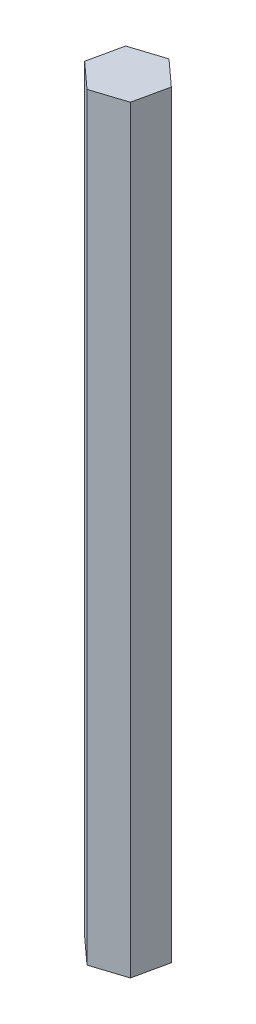
ISO-10303-21;
HEADER;
FILE_DESCRIPTION(('STEP AP214'),'2;1');
FILE_NAME('part.step','',(''),(''),'','','');
FILE_SCHEMA(('AUTOMOTIVE_DESIGN { 1 0 10303 214 1 1 1 1 }'));
ENDSEC;
DATA;
#1=APPLICATION_CONTEXT('core data for automotive mechanical design processes');
#2=APPLICATION_PROTOCOL_DEFINITION('international standard','automotive_design',2000,#1);
#3=PRODUCT_CONTEXT('',#1,'mechanical');
#4=PRODUCT('Part','Part','',(#3));
#5=PRODUCT_RELATED_PRODUCT_CATEGORY('part','',(#4));
#6=PRODUCT_DEFINITION_FORMATION('','',#4);
#7=PRODUCT_DEFINITION_CONTEXT('part definition',#1,'design');
#8=PRODUCT_DEFINITION('design','',#6,#7);
#9=PRODUCT_DEFINITION_SHAPE('','',#8);
#10=(LENGTH_UNIT() NAMED_UNIT(*) SI_UNIT(.MILLI.,.METRE.));
#11=(NAMED_UNIT(*) PLANE_ANGLE_UNIT() SI_UNIT($,.RADIAN.));
#12=(NAMED_UNIT(*) SI_UNIT($,.STERADIAN.) SOLID_ANGLE_UNIT());
#13=UNCERTAINTY_MEASURE_WITH_UNIT(LENGTH_MEASURE(1.E-05),#10,'distance_accuracy_value','');
#14=(GEOMETRIC_REPRESENTATION_CONTEXT(3) GLOBAL_UNCERTAINTY_ASSIGNED_CONTEXT((#13)) GLOBAL_UNIT_ASSIGNED_CONTEXT((#10,
#11,#12)) REPRESENTATION_CONTEXT('',''));
#15=CARTESIAN_POINT('',(0.,0.,0.));
#16=DIRECTION('',(0.,0.,1.));
#17=DIRECTION('',(1.,0.,0.));
#18=AXIS2_PLACEMENT_3D('',#15,#16,#17);
#19=CARTESIAN_POINT('',(-0.61182187926995,63.5,2.82117126764399));
#20=DIRECTION('',(-0.305094633460301,0.,-0.952322038300976));
#21=DIRECTION('',(-0.952322038300976,0.,0.305094633460301));
#22=AXIS2_PLACEMENT_3D('',#19,#20,#21);
#23=PLANE('',#22);
#24=DIRECTION('',(0.952322038300976,0.,-0.305094633460301));
#25=VECTOR('',#24,1.);
#26=CARTESIAN_POINT('',(-0.61182187926995,0.,2.82117126764399));
#27=LINE('',#26,#25);
#28=CARTESIAN_POINT('',(-0.61182187926995,0.,2.82117126764399));
#29=VERTEX_POINT('',#28);
#30=CARTESIAN_POINT('',(2.13729504657146,0.,1.94043892386091));
#31=VERTEX_POINT('',#30);
#32=EDGE_CURVE('E117',#29,#31,#27,.T.);
#33=ORIENTED_EDGE('',*,*,#32,.T.);
#34=DIRECTION('',(0.,-1.,0.));
#35=VECTOR('',#34,1.);
#36=CARTESIAN_POINT('',(2.13729504657146,63.5,1.94043892386091));
#37=LINE('',#36,#35);
#38=CARTESIAN_POINT('',(2.13729504657146,63.5,1.94043892386091));
#39=VERTEX_POINT('',#38);
#40=EDGE_CURVE('E11',#39,#31,#37,.T.);
#41=ORIENTED_EDGE('',*,*,#40,.F.);
#42=DIRECTION('',(0.952322038300976,0.,-0.305094633460301));
#43=VECTOR('',#42,1.);
#44=CARTESIAN_POINT('',(-0.61182187926995,63.5,2.82117126764399));
#45=LINE('',#44,#43);
#46=CARTESIAN_POINT('',(-0.61182187926995,63.5,2.82117126764399));
#47=VERTEX_POINT('',#46);
#48=EDGE_CURVE('E127',#47,#39,#45,.T.);
#49=ORIENTED_EDGE('',*,*,#48,.F.);
#50=DIRECTION('',(0.,-1.,0.));
#51=VECTOR('',#50,1.);
#52=CARTESIAN_POINT('',(-0.61182187926995,63.5,2.82117126764399));
#53=LINE('',#52,#51);
#54=EDGE_CURVE('E113',#47,#29,#53,.T.);
#55=ORIENTED_EDGE('',*,*,#54,.T.);
#56=EDGE_LOOP('',(#33,#41,#49,#55));
#57=FACE_BOUND('',#56,.T.);
#58=ADVANCED_FACE('F33',(#57),#23,.F.);
#59=CARTESIAN_POINT('',(2.13729504657146,63.5,1.94043892386091));
#60=DIRECTION('',(-0.977282394482572,0.,-0.211941316015566));
#61=DIRECTION('',(-0.211941316015566,0.,0.977282394482572));
#62=AXIS2_PLACEMENT_3D('',#59,#60,#61);
#63=PLANE('',#62);
#64=DIRECTION('',(0.211941316015566,0.,-0.977282394482572));
#65=VECTOR('',#64,1.);
#66=CARTESIAN_POINT('',(2.13729504657146,0.,1.94043892386091));
#67=LINE('',#66,#65);
#68=CARTESIAN_POINT('',(2.74911692584142,0.,-0.880732343783076));
#69=VERTEX_POINT('',#68);
#70=EDGE_CURVE('E120',#31,#69,#67,.T.);
#71=ORIENTED_EDGE('',*,*,#70,.T.);
#72=DIRECTION('',(0.,-1.,0.));
#73=VECTOR('',#72,1.);
#74=CARTESIAN_POINT('',(2.74911692584142,63.5,-0.880732343783076));
#75=LINE('',#74,#73);
#76=CARTESIAN_POINT('',(2.74911692584142,63.5,-0.880732343783076));
#77=VERTEX_POINT('',#76);
#78=EDGE_CURVE('E41',#77,#69,#75,.T.);
#79=ORIENTED_EDGE('',*,*,#78,.F.);
#80=DIRECTION('',(0.211941316015566,0.,-0.977282394482572));
#81=VECTOR('',#80,1.);
#82=CARTESIAN_POINT('',(2.13729504657146,63.5,1.94043892386091));
#83=LINE('',#82,#81);
#84=EDGE_CURVE('E86',#39,#77,#83,.T.);
#85=ORIENTED_EDGE('',*,*,#84,.F.);
#86=ORIENTED_EDGE('',*,*,#40,.T.);
#87=EDGE_LOOP('',(#71,#79,#85,#86));
#88=FACE_BOUND('',#87,.T.);
#89=ADVANCED_FACE('F151',(#88),#63,.F.);
#90=CARTESIAN_POINT('',(2.74911692584142,63.5,-0.880732343783076));
#91=DIRECTION('',(-0.672187761022271,0.,0.74038072228541));
#92=DIRECTION('',(0.74038072228541,0.,0.672187761022271));
#93=AXIS2_PLACEMENT_3D('',#90,#91,#92);
#94=PLANE('',#93);
#95=DIRECTION('',(-0.74038072228541,0.,-0.672187761022271));
#96=VECTOR('',#95,1.);
#97=CARTESIAN_POINT('',(2.74911692584142,0.,-0.880732343783076));
#98=LINE('',#97,#96);
#99=CARTESIAN_POINT('',(0.611821879269952,0.,-2.82117126764399));
#100=VERTEX_POINT('',#99);
#101=EDGE_CURVE('E122',#69,#100,#98,.T.);
#102=ORIENTED_EDGE('',*,*,#101,.T.);
#103=DIRECTION('',(0.,-1.,0.));
#104=VECTOR('',#103,1.);
#105=CARTESIAN_POINT('',(0.611821879269952,63.5,-2.82117126764399));
#106=LINE('',#105,#104);
#107=CARTESIAN_POINT('',(0.611821879269952,63.5,-2.82117126764399));
#108=VERTEX_POINT('',#107);
#109=EDGE_CURVE('E108',#108,#100,#106,.T.);
#110=ORIENTED_EDGE('',*,*,#109,.F.);
#111=DIRECTION('',(-0.74038072228541,0.,-0.672187761022271));
#112=VECTOR('',#111,1.);
#113=CARTESIAN_POINT('',(2.74911692584142,63.5,-0.880732343783076));
#114=LINE('',#113,#112);
#115=EDGE_CURVE('E99',#77,#108,#114,.T.);
#116=ORIENTED_EDGE('',*,*,#115,.F.);
#117=ORIENTED_EDGE('',*,*,#78,.T.);
#118=EDGE_LOOP('',(#102,#110,#116,#117));
#119=FACE_BOUND('',#118,.T.);
#120=ADVANCED_FACE('F133',(#119),#94,.F.);
#121=CARTESIAN_POINT('',(0.611821879269952,63.5,-2.82117126764399));
#122=DIRECTION('',(0.305094633460301,0.,0.952322038300975));
#123=DIRECTION('',(0.952322038300976,0.,-0.305094633460301));
#124=AXIS2_PLACEMENT_3D('',#121,#122,#123);
#125=PLANE('',#124);
#126=DIRECTION('',(-0.952322038300976,0.,0.305094633460301));
#127=VECTOR('',#126,1.);
#128=CARTESIAN_POINT('',(0.611821879269952,0.,-2.82117126764399));
#129=LINE('',#128,#127);
#130=CARTESIAN_POINT('',(-2.13729504657146,0.,-1.94043892386091));
#131=VERTEX_POINT('',#130);
#132=EDGE_CURVE('E107',#100,#131,#129,.T.);
#133=ORIENTED_EDGE('',*,*,#132,.T.);
#134=DIRECTION('',(0.,-1.,0.));
#135=VECTOR('',#134,1.);
#136=CARTESIAN_POINT('',(-2.13729504657146,63.5,-1.94043892386091));
#137=LINE('',#136,#135);
#138=CARTESIAN_POINT('',(-2.13729504657146,63.5,-1.94043892386091));
#139=VERTEX_POINT('',#138);
#140=EDGE_CURVE('E104',#139,#131,#137,.T.);
#141=ORIENTED_EDGE('',*,*,#140,.F.);
#142=DIRECTION('',(-0.952322038300976,0.,0.305094633460301));
#143=VECTOR('',#142,1.);
#144=CARTESIAN_POINT('',(0.611821879269952,63.5,-2.82117126764399));
#145=LINE('',#144,#143);
#146=EDGE_CURVE('E93',#108,#139,#145,.T.);
#147=ORIENTED_EDGE('',*,*,#146,.F.);
#148=ORIENTED_EDGE('',*,*,#109,.T.);
#149=EDGE_LOOP('',(#133,#141,#147,#148));
#150=FACE_BOUND('',#149,.T.);
#151=ADVANCED_FACE('F105',(#150),#125,.F.);
#152=CARTESIAN_POINT('',(-2.13729504657146,63.5,-1.94043892386091));
#153=DIRECTION('',(0.977282394482573,0.,0.211941316015565));
#154=DIRECTION('',(0.211941316015565,0.,-0.977282394482573));
#155=AXIS2_PLACEMENT_3D('',#152,#153,#154);
#156=PLANE('',#155);
#157=DIRECTION('',(-0.211941316015565,0.,0.977282394482572));
#158=VECTOR('',#157,1.);
#159=CARTESIAN_POINT('',(-2.13729504657146,0.,-1.94043892386091));
#160=LINE('',#159,#158);
#161=CARTESIAN_POINT('',(-2.74911692584141,0.,0.88073234378308));
#162=VERTEX_POINT('',#161);
#163=EDGE_CURVE('E72',#131,#162,#160,.T.);
#164=ORIENTED_EDGE('',*,*,#163,.T.);
#165=DIRECTION('',(0.,-1.,0.));
#166=VECTOR('',#165,1.);
#167=CARTESIAN_POINT('',(-2.74911692584141,63.5,0.88073234378308));
#168=LINE('',#167,#166);
#169=CARTESIAN_POINT('',(-2.74911692584141,63.5,0.88073234378308));
#170=VERTEX_POINT('',#169);
#171=EDGE_CURVE('E109',#170,#162,#168,.T.);
#172=ORIENTED_EDGE('',*,*,#171,.F.);
#173=DIRECTION('',(-0.211941316015565,0.,0.977282394482572));
#174=VECTOR('',#173,1.);
#175=CARTESIAN_POINT('',(-2.13729504657146,63.5,-1.94043892386091));
#176=LINE('',#175,#174);
#177=EDGE_CURVE('E97',#139,#170,#176,.T.);
#178=ORIENTED_EDGE('',*,*,#177,.F.);
#179=ORIENTED_EDGE('',*,*,#140,.T.);
#180=EDGE_LOOP('',(#164,#172,#178,#179));
#181=FACE_BOUND('',#180,.T.);
#182=ADVANCED_FACE('F111',(#181),#156,.F.);
#183=CARTESIAN_POINT('',(-2.74911692584141,63.5,0.88073234378308));
#184=DIRECTION('',(0.672187761022271,0.,-0.74038072228541));
#185=DIRECTION('',(-0.740380722285411,0.,-0.672187761022271));
#186=AXIS2_PLACEMENT_3D('',#183,#184,#185);
#187=PLANE('',#186);
#188=DIRECTION('',(0.740380722285411,0.,0.672187761022271));
#189=VECTOR('',#188,1.);
#190=CARTESIAN_POINT('',(-2.74911692584141,0.,0.88073234378308));
#191=LINE('',#190,#189);
#192=EDGE_CURVE('E78',#162,#29,#191,.T.);
#193=ORIENTED_EDGE('',*,*,#192,.T.);
#194=ORIENTED_EDGE('',*,*,#54,.F.);
#195=DIRECTION('',(0.740380722285411,0.,0.672187761022271));
#196=VECTOR('',#195,1.);
#197=CARTESIAN_POINT('',(-2.74911692584141,63.5,0.88073234378308));
#198=LINE('',#197,#196);
#199=EDGE_CURVE('E49',#170,#47,#198,.T.);
#200=ORIENTED_EDGE('',*,*,#199,.F.);
#201=ORIENTED_EDGE('',*,*,#171,.T.);
#202=EDGE_LOOP('',(#193,#194,#200,#201));
#203=FACE_BOUND('',#202,.T.);
#204=ADVANCED_FACE('F140',(#203),#187,.F.);
#205=CARTESIAN_POINT('',(0.,63.5,0.));
#206=DIRECTION('',(0.,1.,0.));
#207=DIRECTION('',(0.,0.,1.));
#208=AXIS2_PLACEMENT_3D('',#205,#206,#207);
#209=PLANE('',#208);
#210=ORIENTED_EDGE('',*,*,#48,.T.);
#211=ORIENTED_EDGE('',*,*,#84,.T.);
#212=ORIENTED_EDGE('',*,*,#115,.T.);
#213=ORIENTED_EDGE('',*,*,#146,.T.);
#214=ORIENTED_EDGE('',*,*,#177,.T.);
#215=ORIENTED_EDGE('',*,*,#199,.T.);
#216=EDGE_LOOP('',(#210,#211,#212,#213,#214,#215));
#217=FACE_BOUND('',#216,.T.);
#218=ADVANCED_FACE('F95',(#217),#209,.T.);
#219=CARTESIAN_POINT('',(0.,0.,0.));
#220=DIRECTION('',(0.,1.,0.));
#221=DIRECTION('',(0.,0.,1.));
#222=AXIS2_PLACEMENT_3D('',#219,#220,#221);
#223=PLANE('',#222);
#224=ORIENTED_EDGE('',*,*,#32,.F.);
#225=ORIENTED_EDGE('',*,*,#192,.F.);
#226=ORIENTED_EDGE('',*,*,#163,.F.);
#227=ORIENTED_EDGE('',*,*,#132,.F.);
#228=ORIENTED_EDGE('',*,*,#101,.F.);
#229=ORIENTED_EDGE('',*,*,#70,.F.);
#230=EDGE_LOOP('',(#224,#225,#226,#227,#228,#229));
#231=FACE_BOUND('',#230,.T.);
#232=ADVANCED_FACE('F136',(#231),#223,.F.);
#233=CLOSED_SHELL('',(#58,#89,#120,#151,#182,#204,#218,#232));
#234=MANIFOLD_SOLID_BREP('B2',#233);
#235=ADVANCED_BREP_SHAPE_REPRESENTATION('',(#18,#234),#14);
#236=SHAPE_DEFINITION_REPRESENTATION(#9,#235);
ENDSEC;
END-ISO-10303-21;
